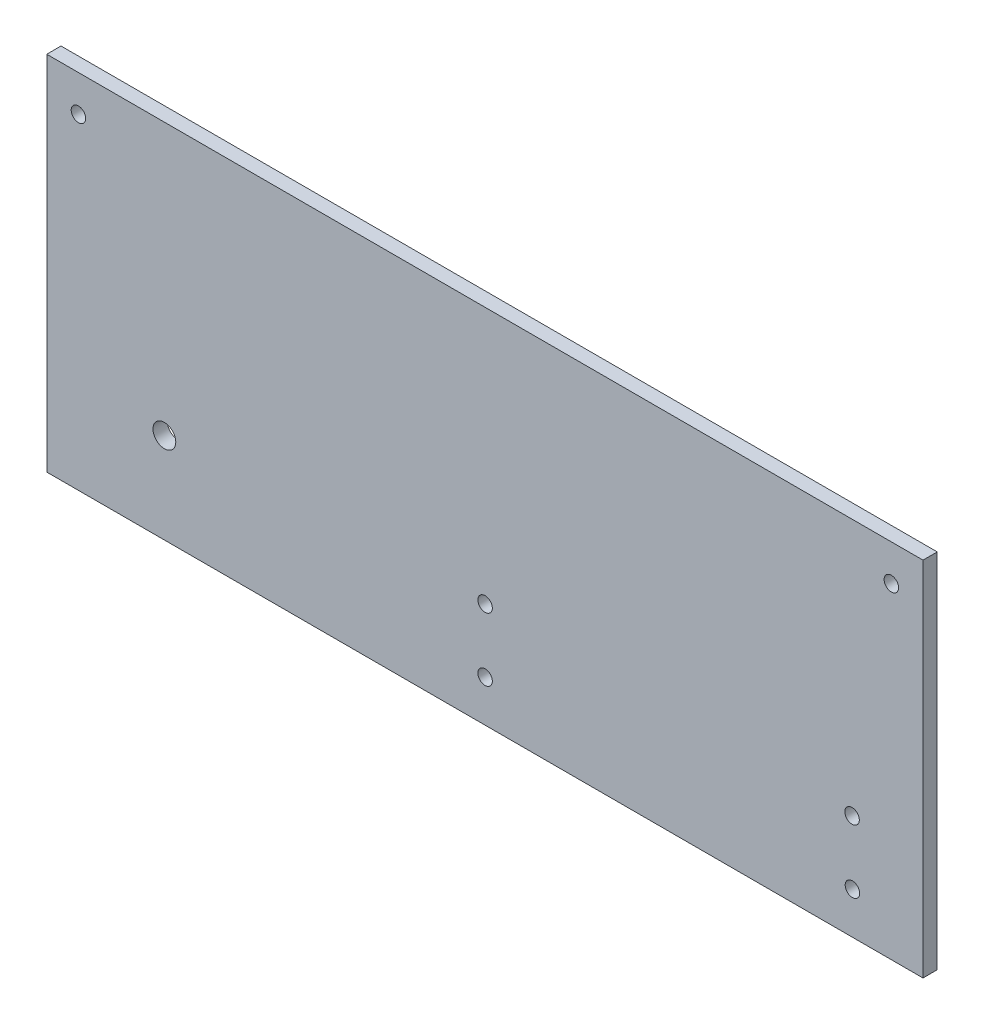
ISO-10303-21;
HEADER;
FILE_DESCRIPTION(('STEP AP214'),'2;1');
FILE_NAME('part.step','',(''),(''),'','','');
FILE_SCHEMA(('AUTOMOTIVE_DESIGN { 1 0 10303 214 1 1 1 1 }'));
ENDSEC;
DATA;
#1=APPLICATION_CONTEXT('core data for automotive mechanical design processes');
#2=APPLICATION_PROTOCOL_DEFINITION('international standard','automotive_design',2000,#1);
#3=PRODUCT_CONTEXT('',#1,'mechanical');
#4=PRODUCT('Part','Part','',(#3));
#5=PRODUCT_RELATED_PRODUCT_CATEGORY('part','',(#4));
#6=PRODUCT_DEFINITION_FORMATION('','',#4);
#7=PRODUCT_DEFINITION_CONTEXT('part definition',#1,'design');
#8=PRODUCT_DEFINITION('design','',#6,#7);
#9=PRODUCT_DEFINITION_SHAPE('','',#8);
#10=(LENGTH_UNIT() NAMED_UNIT(*) SI_UNIT(.MILLI.,.METRE.));
#11=(NAMED_UNIT(*) PLANE_ANGLE_UNIT() SI_UNIT($,.RADIAN.));
#12=(NAMED_UNIT(*) SI_UNIT($,.STERADIAN.) SOLID_ANGLE_UNIT());
#13=UNCERTAINTY_MEASURE_WITH_UNIT(LENGTH_MEASURE(1.E-05),#10,'distance_accuracy_value','');
#14=(GEOMETRIC_REPRESENTATION_CONTEXT(3) GLOBAL_UNCERTAINTY_ASSIGNED_CONTEXT((#13)) GLOBAL_UNIT_ASSIGNED_CONTEXT((#10,
#11,#12)) REPRESENTATION_CONTEXT('',''));
#15=CARTESIAN_POINT('',(0.,0.,0.));
#16=DIRECTION('',(0.,0.,1.));
#17=DIRECTION('',(1.,0.,0.));
#18=AXIS2_PLACEMENT_3D('',#15,#16,#17);
#19=CARTESIAN_POINT('',(0.,0.,4.));
#20=DIRECTION('',(0.,0.,-1.));
#21=DIRECTION('',(-1.,0.,0.));
#22=AXIS2_PLACEMENT_3D('',#19,#20,#21);
#23=PLANE('',#22);
#24=DIRECTION('',(0.,-1.,0.));
#25=VECTOR('',#24,1.);
#26=CARTESIAN_POINT('',(4.,0.,4.));
#27=LINE('',#26,#25);
#28=CARTESIAN_POINT('',(4.,101.6,4.));
#29=VERTEX_POINT('',#28);
#30=CARTESIAN_POINT('',(4.,0.,4.));
#31=VERTEX_POINT('',#30);
#32=EDGE_CURVE('E96',#29,#31,#27,.T.);
#33=ORIENTED_EDGE('',*,*,#32,.T.);
#34=DIRECTION('',(1.,0.,0.));
#35=VECTOR('',#34,1.);
#36=CARTESIAN_POINT('',(250.,0.,4.));
#37=LINE('',#36,#35);
#38=CARTESIAN_POINT('',(250.,0.,4.));
#39=VERTEX_POINT('',#38);
#40=EDGE_CURVE('E91',#31,#39,#37,.T.);
#41=ORIENTED_EDGE('',*,*,#40,.T.);
#42=DIRECTION('',(0.,1.,0.));
#43=VECTOR('',#42,1.);
#44=CARTESIAN_POINT('',(250.,0.,4.));
#45=LINE('',#44,#43);
#46=CARTESIAN_POINT('',(250.,101.6,4.));
#47=VERTEX_POINT('',#46);
#48=EDGE_CURVE('E94',#39,#47,#45,.T.);
#49=ORIENTED_EDGE('',*,*,#48,.T.);
#50=DIRECTION('',(-1.,0.,0.));
#51=VECTOR('',#50,1.);
#52=CARTESIAN_POINT('',(4.,101.6,4.));
#53=LINE('',#52,#51);
#54=EDGE_CURVE('E61',#47,#29,#53,.T.);
#55=ORIENTED_EDGE('',*,*,#54,.T.);
#56=EDGE_LOOP('',(#33,#41,#49,#55));
#57=FACE_BOUND('',#56,.T.);
#58=CARTESIAN_POINT('',(230.0864,29.464,4.));
#59=DIRECTION('',(0.,0.,1.));
#60=DIRECTION('',(1.,0.,0.));
#61=AXIS2_PLACEMENT_3D('',#58,#59,#60);
#62=CIRCLE('',#61,2.03200000000001);
#63=CARTESIAN_POINT('',(232.1184,29.464,4.));
#64=VERTEX_POINT('',#63);
#65=EDGE_CURVE('E116',#64,#64,#62,.T.);
#66=ORIENTED_EDGE('',*,*,#65,.F.);
#67=EDGE_LOOP('',(#66));
#68=FACE_BOUND('',#67,.T.);
#69=CARTESIAN_POINT('',(230.188,11.684,4.));
#70=DIRECTION('',(0.,0.,1.));
#71=DIRECTION('',(1.,0.,0.));
#72=AXIS2_PLACEMENT_3D('',#69,#70,#71);
#73=CIRCLE('',#72,2.03200000000001);
#74=CARTESIAN_POINT('',(232.22,11.684,4.));
#75=VERTEX_POINT('',#74);
#76=EDGE_CURVE('E138',#75,#75,#73,.T.);
#77=ORIENTED_EDGE('',*,*,#76,.F.);
#78=EDGE_LOOP('',(#77));
#79=FACE_BOUND('',#78,.T.);
#80=CARTESIAN_POINT('',(37.02,25.4,4.));
#81=DIRECTION('',(0.,0.,1.));
#82=DIRECTION('',(1.,0.,0.));
#83=AXIS2_PLACEMENT_3D('',#80,#81,#82);
#84=CIRCLE('',#83,3.2004);
#85=CARTESIAN_POINT('',(40.2204,25.4,4.));
#86=VERTEX_POINT('',#85);
#87=EDGE_CURVE('E146',#86,#86,#84,.T.);
#88=ORIENTED_EDGE('',*,*,#87,.F.);
#89=EDGE_LOOP('',(#88));
#90=FACE_BOUND('',#89,.T.);
#91=CARTESIAN_POINT('',(12.89,91.44,4.));
#92=DIRECTION('',(0.,0.,1.));
#93=DIRECTION('',(1.,0.,0.));
#94=AXIS2_PLACEMENT_3D('',#91,#92,#93);
#95=CIRCLE('',#94,2.032);
#96=CARTESIAN_POINT('',(14.922,91.44,4.));
#97=VERTEX_POINT('',#96);
#98=EDGE_CURVE('E154',#97,#97,#95,.T.);
#99=ORIENTED_EDGE('',*,*,#98,.F.);
#100=EDGE_LOOP('',(#99));
#101=FACE_BOUND('',#100,.T.);
#102=CARTESIAN_POINT('',(241.11,91.44,4.));
#103=DIRECTION('',(0.,0.,1.));
#104=DIRECTION('',(1.,0.,0.));
#105=AXIS2_PLACEMENT_3D('',#102,#103,#104);
#106=CIRCLE('',#105,2.03200000000001);
#107=CARTESIAN_POINT('',(243.142,91.44,4.));
#108=VERTEX_POINT('',#107);
#109=EDGE_CURVE('E162',#108,#108,#106,.T.);
#110=ORIENTED_EDGE('',*,*,#109,.F.);
#111=EDGE_LOOP('',(#110));
#112=FACE_BOUND('',#111,.T.);
#113=CARTESIAN_POINT('',(127.063,29.464,4.));
#114=DIRECTION('',(0.,0.,1.));
#115=DIRECTION('',(1.,0.,0.));
#116=AXIS2_PLACEMENT_3D('',#113,#114,#115);
#117=CIRCLE('',#116,2.03200000000001);
#118=CARTESIAN_POINT('',(129.095,29.464,4.));
#119=VERTEX_POINT('',#118);
#120=EDGE_CURVE('E170',#119,#119,#117,.T.);
#121=ORIENTED_EDGE('',*,*,#120,.F.);
#122=EDGE_LOOP('',(#121));
#123=FACE_BOUND('',#122,.T.);
#124=CARTESIAN_POINT('',(127.063,11.684,4.));
#125=DIRECTION('',(0.,0.,1.));
#126=DIRECTION('',(1.,0.,0.));
#127=AXIS2_PLACEMENT_3D('',#124,#125,#126);
#128=CIRCLE('',#127,2.03200000000001);
#129=CARTESIAN_POINT('',(129.095,11.684,4.));
#130=VERTEX_POINT('',#129);
#131=EDGE_CURVE('E178',#130,#130,#128,.T.);
#132=ORIENTED_EDGE('',*,*,#131,.F.);
#133=EDGE_LOOP('',(#132));
#134=FACE_BOUND('',#133,.T.);
#135=ADVANCED_FACE('F43',(#57,#68,#79,#90,#101,#112,#123,#134),#23,.F.);
#136=CARTESIAN_POINT('',(0.,0.,0.));
#137=DIRECTION('',(0.,0.,-1.));
#138=DIRECTION('',(-1.,0.,0.));
#139=AXIS2_PLACEMENT_3D('',#136,#137,#138);
#140=PLANE('',#139);
#141=CARTESIAN_POINT('',(127.063,29.464,0.));
#142=DIRECTION('',(0.,0.,1.));
#143=DIRECTION('',(1.,0.,0.));
#144=AXIS2_PLACEMENT_3D('',#141,#142,#143);
#145=CIRCLE('',#144,2.03200000000001);
#146=CARTESIAN_POINT('',(129.095,29.464,0.));
#147=VERTEX_POINT('',#146);
#148=EDGE_CURVE('E174',#147,#147,#145,.T.);
#149=ORIENTED_EDGE('',*,*,#148,.T.);
#150=EDGE_LOOP('',(#149));
#151=FACE_BOUND('',#150,.T.);
#152=CARTESIAN_POINT('',(12.89,91.44,0.));
#153=DIRECTION('',(0.,0.,1.));
#154=DIRECTION('',(1.,0.,0.));
#155=AXIS2_PLACEMENT_3D('',#152,#153,#154);
#156=CIRCLE('',#155,2.032);
#157=CARTESIAN_POINT('',(14.922,91.44,0.));
#158=VERTEX_POINT('',#157);
#159=EDGE_CURVE('E158',#158,#158,#156,.T.);
#160=ORIENTED_EDGE('',*,*,#159,.T.);
#161=EDGE_LOOP('',(#160));
#162=FACE_BOUND('',#161,.T.);
#163=CARTESIAN_POINT('',(230.188,11.684,0.));
#164=DIRECTION('',(0.,0.,1.));
#165=DIRECTION('',(1.,0.,0.));
#166=AXIS2_PLACEMENT_3D('',#163,#164,#165);
#167=CIRCLE('',#166,2.03200000000001);
#168=CARTESIAN_POINT('',(232.22,11.684,0.));
#169=VERTEX_POINT('',#168);
#170=EDGE_CURVE('E142',#169,#169,#167,.T.);
#171=ORIENTED_EDGE('',*,*,#170,.T.);
#172=EDGE_LOOP('',(#171));
#173=FACE_BOUND('',#172,.T.);
#174=DIRECTION('',(0.,-1.,0.));
#175=VECTOR('',#174,1.);
#176=CARTESIAN_POINT('',(4.,0.,0.));
#177=LINE('',#176,#175);
#178=CARTESIAN_POINT('',(4.,101.6,0.));
#179=VERTEX_POINT('',#178);
#180=CARTESIAN_POINT('',(4.,0.,0.));
#181=VERTEX_POINT('',#180);
#182=EDGE_CURVE('E112',#179,#181,#177,.T.);
#183=ORIENTED_EDGE('',*,*,#182,.F.);
#184=DIRECTION('',(-1.,0.,0.));
#185=VECTOR('',#184,1.);
#186=CARTESIAN_POINT('',(4.,101.6,0.));
#187=LINE('',#186,#185);
#188=CARTESIAN_POINT('',(250.,101.6,0.));
#189=VERTEX_POINT('',#188);
#190=EDGE_CURVE('E84',#189,#179,#187,.T.);
#191=ORIENTED_EDGE('',*,*,#190,.F.);
#192=DIRECTION('',(0.,1.,0.));
#193=VECTOR('',#192,1.);
#194=CARTESIAN_POINT('',(250.,0.,0.));
#195=LINE('',#194,#193);
#196=CARTESIAN_POINT('',(250.,0.,0.));
#197=VERTEX_POINT('',#196);
#198=EDGE_CURVE('E78',#197,#189,#195,.T.);
#199=ORIENTED_EDGE('',*,*,#198,.F.);
#200=DIRECTION('',(1.,0.,0.));
#201=VECTOR('',#200,1.);
#202=CARTESIAN_POINT('',(250.,0.,0.));
#203=LINE('',#202,#201);
#204=EDGE_CURVE('E101',#181,#197,#203,.T.);
#205=ORIENTED_EDGE('',*,*,#204,.F.);
#206=EDGE_LOOP('',(#183,#191,#199,#205));
#207=FACE_BOUND('',#206,.T.);
#208=CARTESIAN_POINT('',(230.0864,29.464,0.));
#209=DIRECTION('',(0.,0.,1.));
#210=DIRECTION('',(1.,0.,0.));
#211=AXIS2_PLACEMENT_3D('',#208,#209,#210);
#212=CIRCLE('',#211,2.03200000000001);
#213=CARTESIAN_POINT('',(232.1184,29.464,0.));
#214=VERTEX_POINT('',#213);
#215=EDGE_CURVE('E134',#214,#214,#212,.T.);
#216=ORIENTED_EDGE('',*,*,#215,.T.);
#217=EDGE_LOOP('',(#216));
#218=FACE_BOUND('',#217,.T.);
#219=CARTESIAN_POINT('',(37.02,25.4,0.));
#220=DIRECTION('',(0.,0.,1.));
#221=DIRECTION('',(1.,0.,0.));
#222=AXIS2_PLACEMENT_3D('',#219,#220,#221);
#223=CIRCLE('',#222,3.2004);
#224=CARTESIAN_POINT('',(40.2204,25.4,0.));
#225=VERTEX_POINT('',#224);
#226=EDGE_CURVE('E150',#225,#225,#223,.T.);
#227=ORIENTED_EDGE('',*,*,#226,.T.);
#228=EDGE_LOOP('',(#227));
#229=FACE_BOUND('',#228,.T.);
#230=CARTESIAN_POINT('',(241.11,91.44,0.));
#231=DIRECTION('',(0.,0.,1.));
#232=DIRECTION('',(1.,0.,0.));
#233=AXIS2_PLACEMENT_3D('',#230,#231,#232);
#234=CIRCLE('',#233,2.03200000000001);
#235=CARTESIAN_POINT('',(243.142,91.44,0.));
#236=VERTEX_POINT('',#235);
#237=EDGE_CURVE('E166',#236,#236,#234,.T.);
#238=ORIENTED_EDGE('',*,*,#237,.T.);
#239=EDGE_LOOP('',(#238));
#240=FACE_BOUND('',#239,.T.);
#241=CARTESIAN_POINT('',(127.063,11.684,0.));
#242=DIRECTION('',(0.,0.,1.));
#243=DIRECTION('',(1.,0.,0.));
#244=AXIS2_PLACEMENT_3D('',#241,#242,#243);
#245=CIRCLE('',#244,2.03200000000001);
#246=CARTESIAN_POINT('',(129.095,11.684,0.));
#247=VERTEX_POINT('',#246);
#248=EDGE_CURVE('E182',#247,#247,#245,.T.);
#249=ORIENTED_EDGE('',*,*,#248,.T.);
#250=EDGE_LOOP('',(#249));
#251=FACE_BOUND('',#250,.T.);
#252=ADVANCED_FACE('F129',(#151,#162,#173,#207,#218,#229,#240,#251),#140,.T.);
#253=CARTESIAN_POINT('',(4.,0.,4.));
#254=DIRECTION('',(1.,0.,0.));
#255=DIRECTION('',(0.,0.,-1.));
#256=AXIS2_PLACEMENT_3D('',#253,#254,#255);
#257=PLANE('',#256);
#258=ORIENTED_EDGE('',*,*,#182,.T.);
#259=DIRECTION('',(0.,0.,-1.));
#260=VECTOR('',#259,1.);
#261=CARTESIAN_POINT('',(4.,0.,4.));
#262=LINE('',#261,#260);
#263=EDGE_CURVE('E11',#31,#181,#262,.T.);
#264=ORIENTED_EDGE('',*,*,#263,.F.);
#265=ORIENTED_EDGE('',*,*,#32,.F.);
#266=DIRECTION('',(0.,0.,-1.));
#267=VECTOR('',#266,1.);
#268=CARTESIAN_POINT('',(4.,101.6,4.));
#269=LINE('',#268,#267);
#270=EDGE_CURVE('E108',#29,#179,#269,.T.);
#271=ORIENTED_EDGE('',*,*,#270,.T.);
#272=EDGE_LOOP('',(#258,#264,#265,#271));
#273=FACE_BOUND('',#272,.T.);
#274=ADVANCED_FACE('F45',(#273),#257,.F.);
#275=CARTESIAN_POINT('',(250.,0.,4.));
#276=DIRECTION('',(0.,1.,0.));
#277=DIRECTION('',(-1.,0.,0.));
#278=AXIS2_PLACEMENT_3D('',#275,#276,#277);
#279=PLANE('',#278);
#280=ORIENTED_EDGE('',*,*,#204,.T.);
#281=DIRECTION('',(0.,0.,-1.));
#282=VECTOR('',#281,1.);
#283=CARTESIAN_POINT('',(250.,0.,4.));
#284=LINE('',#283,#282);
#285=EDGE_CURVE('E53',#39,#197,#284,.T.);
#286=ORIENTED_EDGE('',*,*,#285,.F.);
#287=ORIENTED_EDGE('',*,*,#40,.F.);
#288=ORIENTED_EDGE('',*,*,#263,.T.);
#289=EDGE_LOOP('',(#280,#286,#287,#288));
#290=FACE_BOUND('',#289,.T.);
#291=ADVANCED_FACE('F100',(#290),#279,.F.);
#292=CARTESIAN_POINT('',(250.,0.,4.));
#293=DIRECTION('',(-1.,0.,0.));
#294=DIRECTION('',(0.,0.,1.));
#295=AXIS2_PLACEMENT_3D('',#292,#293,#294);
#296=PLANE('',#295);
#297=ORIENTED_EDGE('',*,*,#198,.T.);
#298=DIRECTION('',(0.,0.,-1.));
#299=VECTOR('',#298,1.);
#300=CARTESIAN_POINT('',(250.,101.6,4.));
#301=LINE('',#300,#299);
#302=EDGE_CURVE('E103',#47,#189,#301,.T.);
#303=ORIENTED_EDGE('',*,*,#302,.F.);
#304=ORIENTED_EDGE('',*,*,#48,.F.);
#305=ORIENTED_EDGE('',*,*,#285,.T.);
#306=EDGE_LOOP('',(#297,#303,#304,#305));
#307=FACE_BOUND('',#306,.T.);
#308=ADVANCED_FACE('F104',(#307),#296,.F.);
#309=CARTESIAN_POINT('',(4.,101.6,4.));
#310=DIRECTION('',(0.,-1.,0.));
#311=DIRECTION('',(0.,0.,-1.));
#312=AXIS2_PLACEMENT_3D('',#309,#310,#311);
#313=PLANE('',#312);
#314=ORIENTED_EDGE('',*,*,#190,.T.);
#315=ORIENTED_EDGE('',*,*,#270,.F.);
#316=ORIENTED_EDGE('',*,*,#54,.F.);
#317=ORIENTED_EDGE('',*,*,#302,.T.);
#318=EDGE_LOOP('',(#314,#315,#316,#317));
#319=FACE_BOUND('',#318,.T.);
#320=ADVANCED_FACE('F126',(#319),#313,.F.);
#321=CARTESIAN_POINT('',(230.0864,29.464,4.));
#322=DIRECTION('',(0.,0.,-1.));
#323=DIRECTION('',(-1.,0.,0.));
#324=AXIS2_PLACEMENT_3D('',#321,#322,#323);
#325=CYLINDRICAL_SURFACE('',#324,2.03200000000001);
#326=ORIENTED_EDGE('',*,*,#65,.T.);
#327=EDGE_LOOP('',(#326));
#328=FACE_BOUND('',#327,.T.);
#329=ORIENTED_EDGE('',*,*,#215,.F.);
#330=EDGE_LOOP('',(#329));
#331=FACE_BOUND('',#330,.T.);
#332=ADVANCED_FACE('F201',(#328,#331),#325,.F.);
#333=CARTESIAN_POINT('',(230.188,11.684,4.));
#334=DIRECTION('',(0.,0.,-1.));
#335=DIRECTION('',(-1.,0.,0.));
#336=AXIS2_PLACEMENT_3D('',#333,#334,#335);
#337=CYLINDRICAL_SURFACE('',#336,2.03200000000001);
#338=ORIENTED_EDGE('',*,*,#76,.T.);
#339=EDGE_LOOP('',(#338));
#340=FACE_BOUND('',#339,.T.);
#341=ORIENTED_EDGE('',*,*,#170,.F.);
#342=EDGE_LOOP('',(#341));
#343=FACE_BOUND('',#342,.T.);
#344=ADVANCED_FACE('F255',(#340,#343),#337,.F.);
#345=CARTESIAN_POINT('',(37.02,25.4,4.));
#346=DIRECTION('',(0.,0.,-1.));
#347=DIRECTION('',(-1.,0.,0.));
#348=AXIS2_PLACEMENT_3D('',#345,#346,#347);
#349=CYLINDRICAL_SURFACE('',#348,3.2004);
#350=ORIENTED_EDGE('',*,*,#87,.T.);
#351=EDGE_LOOP('',(#350));
#352=FACE_BOUND('',#351,.T.);
#353=ORIENTED_EDGE('',*,*,#226,.F.);
#354=EDGE_LOOP('',(#353));
#355=FACE_BOUND('',#354,.T.);
#356=ADVANCED_FACE('F264',(#352,#355),#349,.F.);
#357=CARTESIAN_POINT('',(12.89,91.44,4.));
#358=DIRECTION('',(0.,0.,-1.));
#359=DIRECTION('',(-1.,0.,0.));
#360=AXIS2_PLACEMENT_3D('',#357,#358,#359);
#361=CYLINDRICAL_SURFACE('',#360,2.032);
#362=ORIENTED_EDGE('',*,*,#98,.T.);
#363=EDGE_LOOP('',(#362));
#364=FACE_BOUND('',#363,.T.);
#365=ORIENTED_EDGE('',*,*,#159,.F.);
#366=EDGE_LOOP('',(#365));
#367=FACE_BOUND('',#366,.T.);
#368=ADVANCED_FACE('F273',(#364,#367),#361,.F.);
#369=CARTESIAN_POINT('',(241.11,91.44,4.));
#370=DIRECTION('',(0.,0.,-1.));
#371=DIRECTION('',(-1.,0.,0.));
#372=AXIS2_PLACEMENT_3D('',#369,#370,#371);
#373=CYLINDRICAL_SURFACE('',#372,2.03200000000001);
#374=ORIENTED_EDGE('',*,*,#109,.T.);
#375=EDGE_LOOP('',(#374));
#376=FACE_BOUND('',#375,.T.);
#377=ORIENTED_EDGE('',*,*,#237,.F.);
#378=EDGE_LOOP('',(#377));
#379=FACE_BOUND('',#378,.T.);
#380=ADVANCED_FACE('F283',(#376,#379),#373,.F.);
#381=CARTESIAN_POINT('',(127.063,29.464,4.));
#382=DIRECTION('',(0.,0.,-1.));
#383=DIRECTION('',(-1.,0.,0.));
#384=AXIS2_PLACEMENT_3D('',#381,#382,#383);
#385=CYLINDRICAL_SURFACE('',#384,2.03200000000001);
#386=ORIENTED_EDGE('',*,*,#120,.T.);
#387=EDGE_LOOP('',(#386));
#388=FACE_BOUND('',#387,.T.);
#389=ORIENTED_EDGE('',*,*,#148,.F.);
#390=EDGE_LOOP('',(#389));
#391=FACE_BOUND('',#390,.T.);
#392=ADVANCED_FACE('F293',(#388,#391),#385,.F.);
#393=CARTESIAN_POINT('',(127.063,11.684,4.));
#394=DIRECTION('',(0.,0.,-1.));
#395=DIRECTION('',(-1.,0.,0.));
#396=AXIS2_PLACEMENT_3D('',#393,#394,#395);
#397=CYLINDRICAL_SURFACE('',#396,2.03200000000001);
#398=ORIENTED_EDGE('',*,*,#131,.T.);
#399=EDGE_LOOP('',(#398));
#400=FACE_BOUND('',#399,.T.);
#401=ORIENTED_EDGE('',*,*,#248,.F.);
#402=EDGE_LOOP('',(#401));
#403=FACE_BOUND('',#402,.T.);
#404=ADVANCED_FACE('F190',(#400,#403),#397,.F.);
#405=CLOSED_SHELL('',(#135,#252,#274,#291,#308,#320,#332,#344,#356,#368,#380,#392,#404));
#406=MANIFOLD_SOLID_BREP('B2',#405);
#407=ADVANCED_BREP_SHAPE_REPRESENTATION('',(#18,#406),#14);
#408=SHAPE_DEFINITION_REPRESENTATION(#9,#407);
ENDSEC;
END-ISO-10303-21;
